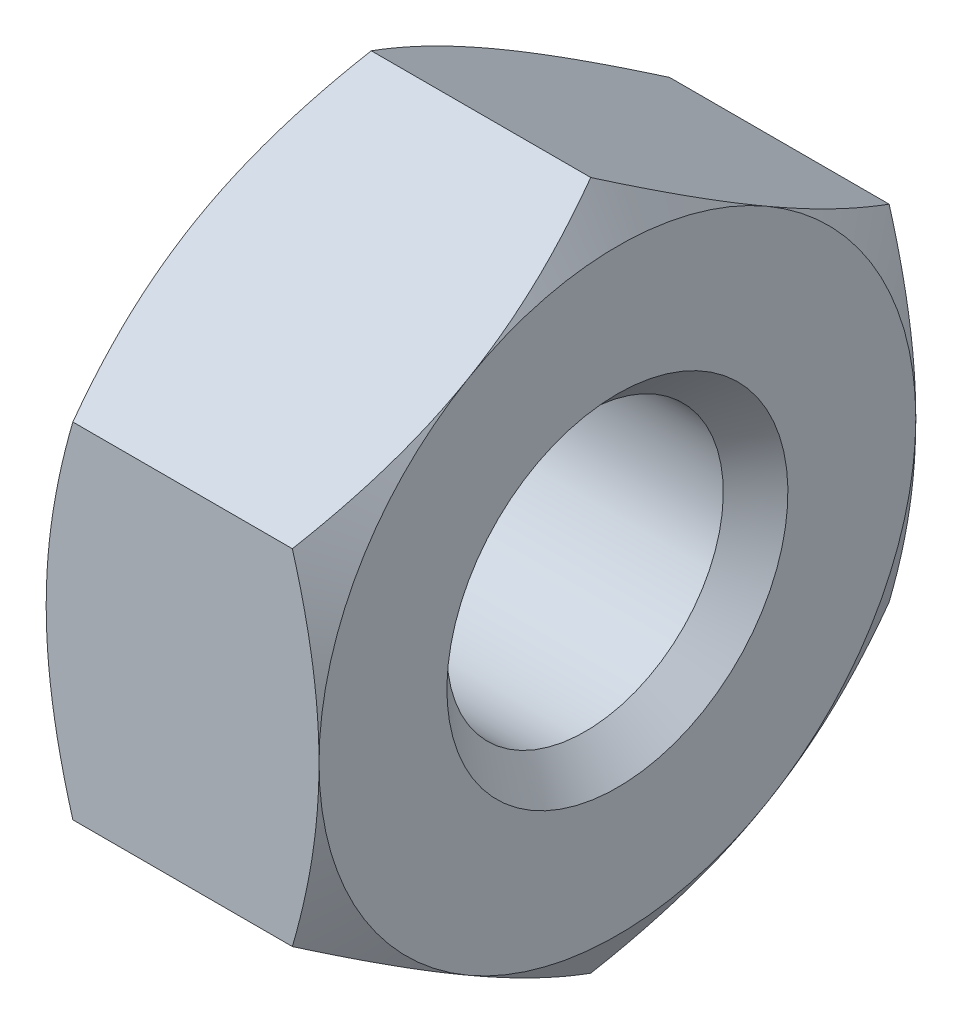
ISO-10303-21;
HEADER;
FILE_DESCRIPTION(('STEP AP214'),'2;1');
FILE_NAME('part.step','',(''),(''),'','','');
FILE_SCHEMA(('AUTOMOTIVE_DESIGN { 1 0 10303 214 1 1 1 1 }'));
ENDSEC;
DATA;
#1=APPLICATION_CONTEXT('core data for automotive mechanical design processes');
#2=APPLICATION_PROTOCOL_DEFINITION('international standard','automotive_design',2000,#1);
#3=PRODUCT_CONTEXT('',#1,'mechanical');
#4=PRODUCT('Part','Part','',(#3));
#5=PRODUCT_RELATED_PRODUCT_CATEGORY('part','',(#4));
#6=PRODUCT_DEFINITION_FORMATION('','',#4);
#7=PRODUCT_DEFINITION_CONTEXT('part definition',#1,'design');
#8=PRODUCT_DEFINITION('design','',#6,#7);
#9=PRODUCT_DEFINITION_SHAPE('','',#8);
#10=(LENGTH_UNIT() NAMED_UNIT(*) SI_UNIT(.MILLI.,.METRE.));
#11=(NAMED_UNIT(*) PLANE_ANGLE_UNIT() SI_UNIT($,.RADIAN.));
#12=(NAMED_UNIT(*) SI_UNIT($,.STERADIAN.) SOLID_ANGLE_UNIT());
#13=UNCERTAINTY_MEASURE_WITH_UNIT(LENGTH_MEASURE(1.E-05),#10,'distance_accuracy_value','');
#14=(GEOMETRIC_REPRESENTATION_CONTEXT(3) GLOBAL_UNCERTAINTY_ASSIGNED_CONTEXT((#13)) GLOBAL_UNIT_ASSIGNED_CONTEXT((#10,
#11,#12)) REPRESENTATION_CONTEXT('',''));
#15=CARTESIAN_POINT('',(0.,0.,0.));
#16=DIRECTION('',(0.,0.,1.));
#17=DIRECTION('',(1.,0.,0.));
#18=AXIS2_PLACEMENT_3D('',#15,#16,#17);
#19=DIRECTION('',(-0.707106781186547,0.707106781186548,0.));
#20=VECTOR('',#19,1.);
#21=CARTESIAN_POINT('',(-498998.,499000.,0.));
#22=LINE('',#21,#20);
#23=CARTESIAN_POINT('',(2.,0.,0.));
#24=DIRECTION('',(-1.,0.,0.));
#25=AXIS1_PLACEMENT('',#23,#24);
#26=SURFACE_OF_REVOLUTION('',#22,#25);
#27=CARTESIAN_POINT('',(0.379,0.,0.));
#28=DIRECTION('',(-1.,0.,0.));
#29=DIRECTION('',(0.,1.,0.));
#30=AXIS2_PLACEMENT_3D('',#27,#28,#29);
#31=CIRCLE('',#30,1.621);
#32=CARTESIAN_POINT('',(0.379,1.621,0.));
#33=VERTEX_POINT('',#32);
#34=EDGE_CURVE('E146',#33,#33,#31,.T.);
#35=ORIENTED_EDGE('',*,*,#34,.F.);
#36=EDGE_LOOP('',(#35));
#37=FACE_BOUND('',#36,.T.);
#38=CARTESIAN_POINT('',(0.,0.,0.));
#39=DIRECTION('',(-1.,0.,0.));
#40=DIRECTION('',(0.,1.,0.));
#41=AXIS2_PLACEMENT_3D('',#38,#39,#40);
#42=CIRCLE('',#41,2.);
#43=CARTESIAN_POINT('',(0.,2.,0.));
#44=VERTEX_POINT('',#43);
#45=EDGE_CURVE('E327',#44,#44,#42,.T.);
#46=ORIENTED_EDGE('',*,*,#45,.T.);
#47=EDGE_LOOP('',(#46));
#48=FACE_BOUND('',#47,.T.);
#49=ADVANCED_FACE('F16',(#37,#48),#26,.F.);
#50=CARTESIAN_POINT('',(0.,2.75,0.));
#51=DIRECTION('',(-1.,0.,0.));
#52=DIRECTION('',(0.,-1.,0.));
#53=AXIS2_PLACEMENT_3D('',#50,#51,#52);
#54=PLANE('',#53);
#55=CARTESIAN_POINT('',(0.,0.,0.));
#56=DIRECTION('',(-1.,0.,0.));
#57=DIRECTION('',(0.,1.,0.));
#58=AXIS2_PLACEMENT_3D('',#55,#56,#57);
#59=CIRCLE('',#58,3.5);
#60=CARTESIAN_POINT('',(0.,3.03108891324554,1.75));
#61=VERTEX_POINT('',#60);
#62=CARTESIAN_POINT('',(0.,3.03108891324554,-1.75));
#63=VERTEX_POINT('',#62);
#64=EDGE_CURVE('E10',#61,#63,#59,.T.);
#65=ORIENTED_EDGE('',*,*,#64,.T.);
#66=CARTESIAN_POINT('',(0.,0.,0.));
#67=DIRECTION('',(-1.,0.,0.));
#68=DIRECTION('',(0.,1.,0.));
#69=AXIS2_PLACEMENT_3D('',#66,#67,#68);
#70=CIRCLE('',#69,3.5);
#71=CARTESIAN_POINT('',(0.,0.,-3.5));
#72=VERTEX_POINT('',#71);
#73=EDGE_CURVE('E26',#63,#72,#70,.T.);
#74=ORIENTED_EDGE('',*,*,#73,.T.);
#75=CARTESIAN_POINT('',(0.,0.,0.));
#76=DIRECTION('',(-1.,0.,0.));
#77=DIRECTION('',(0.,1.,0.));
#78=AXIS2_PLACEMENT_3D('',#75,#76,#77);
#79=CIRCLE('',#78,3.5);
#80=CARTESIAN_POINT('',(0.,-3.03108891324553,-1.75));
#81=VERTEX_POINT('',#80);
#82=EDGE_CURVE('E162',#72,#81,#79,.T.);
#83=ORIENTED_EDGE('',*,*,#82,.T.);
#84=CARTESIAN_POINT('',(0.,0.,0.));
#85=DIRECTION('',(-1.,0.,0.));
#86=DIRECTION('',(0.,1.,0.));
#87=AXIS2_PLACEMENT_3D('',#84,#85,#86);
#88=CIRCLE('',#87,3.5);
#89=CARTESIAN_POINT('',(0.,-3.03108891324554,1.75));
#90=VERTEX_POINT('',#89);
#91=EDGE_CURVE('E168',#81,#90,#88,.T.);
#92=ORIENTED_EDGE('',*,*,#91,.T.);
#93=CARTESIAN_POINT('',(0.,0.,0.));
#94=DIRECTION('',(-1.,0.,0.));
#95=DIRECTION('',(0.,1.,0.));
#96=AXIS2_PLACEMENT_3D('',#93,#94,#95);
#97=CIRCLE('',#96,3.5);
#98=CARTESIAN_POINT('',(0.,0.,3.5));
#99=VERTEX_POINT('',#98);
#100=EDGE_CURVE('E382',#90,#99,#97,.T.);
#101=ORIENTED_EDGE('',*,*,#100,.T.);
#102=CARTESIAN_POINT('',(0.,0.,0.));
#103=DIRECTION('',(-1.,0.,0.));
#104=DIRECTION('',(0.,1.,0.));
#105=AXIS2_PLACEMENT_3D('',#102,#103,#104);
#106=CIRCLE('',#105,3.5);
#107=EDGE_CURVE('E355',#99,#61,#106,.T.);
#108=ORIENTED_EDGE('',*,*,#107,.T.);
#109=EDGE_LOOP('',(#65,#74,#83,#92,#101,#108));
#110=FACE_BOUND('',#109,.T.);
#111=ORIENTED_EDGE('',*,*,#45,.F.);
#112=EDGE_LOOP('',(#111));
#113=FACE_BOUND('',#112,.T.);
#114=ADVANCED_FACE('F192',(#110,#113),#54,.T.);
#115=CARTESIAN_POINT('',(3.2,2.75,0.));
#116=DIRECTION('',(1.,0.,0.));
#117=DIRECTION('',(0.,0.,-1.));
#118=AXIS2_PLACEMENT_3D('',#115,#116,#117);
#119=PLANE('',#118);
#120=CARTESIAN_POINT('',(3.2,0.,0.));
#121=DIRECTION('',(-1.,0.,0.));
#122=DIRECTION('',(0.,1.,0.));
#123=AXIS2_PLACEMENT_3D('',#120,#121,#122);
#124=CIRCLE('',#123,2.);
#125=CARTESIAN_POINT('',(3.2,2.,0.));
#126=VERTEX_POINT('',#125);
#127=EDGE_CURVE('E375',#126,#126,#124,.T.);
#128=ORIENTED_EDGE('',*,*,#127,.T.);
#129=EDGE_LOOP('',(#128));
#130=FACE_BOUND('',#129,.T.);
#131=CARTESIAN_POINT('',(3.2,0.,0.));
#132=DIRECTION('',(-1.,0.,0.));
#133=DIRECTION('',(0.,1.,0.));
#134=AXIS2_PLACEMENT_3D('',#131,#132,#133);
#135=CIRCLE('',#134,3.5);
#136=CARTESIAN_POINT('',(3.2,3.03108891324553,1.75));
#137=VERTEX_POINT('',#136);
#138=CARTESIAN_POINT('',(3.2,3.03108891324554,-1.75));
#139=VERTEX_POINT('',#138);
#140=EDGE_CURVE('E128',#137,#139,#135,.T.);
#141=ORIENTED_EDGE('',*,*,#140,.F.);
#142=CARTESIAN_POINT('',(3.2,0.,0.));
#143=DIRECTION('',(-1.,0.,0.));
#144=DIRECTION('',(0.,1.,0.));
#145=AXIS2_PLACEMENT_3D('',#142,#143,#144);
#146=CIRCLE('',#145,3.5);
#147=CARTESIAN_POINT('',(3.2,0.,3.5));
#148=VERTEX_POINT('',#147);
#149=EDGE_CURVE('E132',#148,#137,#146,.T.);
#150=ORIENTED_EDGE('',*,*,#149,.F.);
#151=CARTESIAN_POINT('',(3.2,0.,0.));
#152=DIRECTION('',(-1.,0.,0.));
#153=DIRECTION('',(0.,1.,0.));
#154=AXIS2_PLACEMENT_3D('',#151,#152,#153);
#155=CIRCLE('',#154,3.5);
#156=CARTESIAN_POINT('',(3.2,-3.03108891324554,1.75));
#157=VERTEX_POINT('',#156);
#158=EDGE_CURVE('E79',#157,#148,#155,.T.);
#159=ORIENTED_EDGE('',*,*,#158,.F.);
#160=CARTESIAN_POINT('',(3.2,0.,0.));
#161=DIRECTION('',(-1.,0.,0.));
#162=DIRECTION('',(0.,1.,0.));
#163=AXIS2_PLACEMENT_3D('',#160,#161,#162);
#164=CIRCLE('',#163,3.5);
#165=CARTESIAN_POINT('',(3.2,-3.03108891324553,-1.75));
#166=VERTEX_POINT('',#165);
#167=EDGE_CURVE('E85',#166,#157,#164,.T.);
#168=ORIENTED_EDGE('',*,*,#167,.F.);
#169=CARTESIAN_POINT('',(3.2,0.,0.));
#170=DIRECTION('',(-1.,0.,0.));
#171=DIRECTION('',(0.,1.,0.));
#172=AXIS2_PLACEMENT_3D('',#169,#170,#171);
#173=CIRCLE('',#172,3.5);
#174=CARTESIAN_POINT('',(3.2,0.,-3.5));
#175=VERTEX_POINT('',#174);
#176=EDGE_CURVE('E151',#175,#166,#173,.T.);
#177=ORIENTED_EDGE('',*,*,#176,.F.);
#178=CARTESIAN_POINT('',(3.2,0.,0.));
#179=DIRECTION('',(-1.,0.,0.));
#180=DIRECTION('',(0.,1.,0.));
#181=AXIS2_PLACEMENT_3D('',#178,#179,#180);
#182=CIRCLE('',#181,3.5);
#183=EDGE_CURVE('E407',#139,#175,#182,.T.);
#184=ORIENTED_EDGE('',*,*,#183,.F.);
#185=EDGE_LOOP('',(#141,#150,#159,#168,#177,#184));
#186=FACE_BOUND('',#185,.T.);
#187=ADVANCED_FACE('F196',(#130,#186),#119,.T.);
#188=DIRECTION('',(0.707106781186548,0.707106781186548,0.));
#189=VECTOR('',#188,1.);
#190=CARTESIAN_POINT('',(499000.,498998.8,0.));
#191=LINE('',#190,#189);
#192=CARTESIAN_POINT('',(1.2,0.,0.));
#193=DIRECTION('',(1.,0.,0.));
#194=AXIS1_PLACEMENT('',#192,#193);
#195=SURFACE_OF_REVOLUTION('',#191,#194);
#196=ORIENTED_EDGE('',*,*,#127,.F.);
#197=EDGE_LOOP('',(#196));
#198=FACE_BOUND('',#197,.T.);
#199=CARTESIAN_POINT('',(2.821,0.,0.));
#200=DIRECTION('',(-1.,0.,0.));
#201=DIRECTION('',(0.,1.,0.));
#202=AXIS2_PLACEMENT_3D('',#199,#200,#201);
#203=CIRCLE('',#202,1.621);
#204=CARTESIAN_POINT('',(2.821,1.621,0.));
#205=VERTEX_POINT('',#204);
#206=EDGE_CURVE('E340',#205,#205,#203,.T.);
#207=ORIENTED_EDGE('',*,*,#206,.T.);
#208=EDGE_LOOP('',(#207));
#209=FACE_BOUND('',#208,.T.);
#210=ADVANCED_FACE('F200',(#198,#209),#195,.F.);
#211=CARTESIAN_POINT('',(1.6,0.,0.));
#212=DIRECTION('',(1.,0.,0.));
#213=DIRECTION('',(0.,1.,0.));
#214=AXIS2_PLACEMENT_3D('',#211,#212,#213);
#215=CIRCLE('',#214,1.621);
#216=DIRECTION('',(-1.,0.,0.));
#217=VECTOR('',#216,1.);
#218=SURFACE_OF_LINEAR_EXTRUSION('',#215,#217);
#219=ORIENTED_EDGE('',*,*,#206,.F.);
#220=EDGE_LOOP('',(#219));
#221=FACE_BOUND('',#220,.T.);
#222=ORIENTED_EDGE('',*,*,#34,.T.);
#223=EDGE_LOOP('',(#222));
#224=FACE_BOUND('',#223,.T.);
#225=ADVANCED_FACE('F204',(#221,#224),#218,.T.);
#226=DIRECTION('',(0.5,-0.866025403784439,0.));
#227=VECTOR('',#226,1.);
#228=CARTESIAN_POINT('',(-288092.563599681,499000.,0.));
#229=LINE('',#228,#227);
#230=CARTESIAN_POINT('',(5.22072594216369,0.,0.));
#231=DIRECTION('',(-1.,0.,0.));
#232=AXIS1_PLACEMENT('',#230,#231);
#233=SURFACE_OF_REVOLUTION('',#229,#232);
#234=CARTESIAN_POINT('',(3.2,3.03108891324553,1.75));
#235=CARTESIAN_POINT('',(3.2,2.5621778264912,2.56217782649084));
#236=CARTESIAN_POINT('',(2.88739260883036,2.02072594216369,3.5));
#237=(BOUNDED_CURVE() B_SPLINE_CURVE(2,(#234,#235,#236),.UNSPECIFIED.,.F.,
.F.) B_SPLINE_CURVE_WITH_KNOTS((3,3),(5.47756078911989,8.00558104426728),
.UNSPECIFIED.) CURVE() GEOMETRIC_REPRESENTATION_ITEM() RATIONAL_B_SPLINE_CURVE((1.,
1.08375764941006,1.09020313656982)) REPRESENTATION_ITEM(''));
#238=CARTESIAN_POINT('',(2.88739260883036,2.02072594216369,3.5));
#239=VERTEX_POINT('',#238);
#240=EDGE_CURVE('E124',#137,#239,#237,.T.);
#241=ORIENTED_EDGE('',*,*,#240,.T.);
#242=CARTESIAN_POINT('',(2.88739260883036,2.02072594216369,3.5));
#243=CARTESIAN_POINT('',(3.2,0.937822173508661,3.5));
#244=CARTESIAN_POINT('',(3.2,0.,3.5));
#245=(BOUNDED_CURVE() B_SPLINE_CURVE(2,(#242,#243,#244),.UNSPECIFIED.,.F.,
.F.) B_SPLINE_CURVE_WITH_KNOTS((3,3),(2.94954053397249,5.47756078911989),
.UNSPECIFIED.) CURVE() GEOMETRIC_REPRESENTATION_ITEM() RATIONAL_B_SPLINE_CURVE((1.09020313656981,
1.08375764941006,1.)) REPRESENTATION_ITEM(''));
#246=EDGE_CURVE('E134',#239,#148,#245,.T.);
#247=ORIENTED_EDGE('',*,*,#246,.T.);
#248=ORIENTED_EDGE('',*,*,#149,.T.);
#249=EDGE_LOOP('',(#241,#247,#248));
#250=FACE_BOUND('',#249,.T.);
#251=ADVANCED_FACE('F208',(#250),#233,.F.);
#252=DIRECTION('',(0.5,-0.866025403784439,0.));
#253=VECTOR('',#252,1.);
#254=CARTESIAN_POINT('',(-288092.563599681,499000.,0.));
#255=LINE('',#254,#253);
#256=CARTESIAN_POINT('',(5.22072594216369,0.,0.));
#257=DIRECTION('',(-1.,0.,0.));
#258=AXIS1_PLACEMENT('',#256,#257);
#259=SURFACE_OF_REVOLUTION('',#255,#258);
#260=CARTESIAN_POINT('',(3.2,3.03108891324554,-1.75));
#261=CARTESIAN_POINT('',(3.2,3.49999999999987,-0.93782217350916));
#262=CARTESIAN_POINT('',(2.88739260883036,4.04145188432738,0.));
#263=(BOUNDED_CURVE() B_SPLINE_CURVE(2,(#260,#261,#262),.UNSPECIFIED.,.F.,
.F.) B_SPLINE_CURVE_WITH_KNOTS((3,3),(5.47756078911989,8.00558104426728),
.UNSPECIFIED.) CURVE() GEOMETRIC_REPRESENTATION_ITEM() RATIONAL_B_SPLINE_CURVE((1.,
1.08375764941006,1.09020313656981)) REPRESENTATION_ITEM(''));
#264=CARTESIAN_POINT('',(2.88739260883036,4.04145188432738,0.));
#265=VERTEX_POINT('',#264);
#266=EDGE_CURVE('E110',#139,#265,#263,.T.);
#267=ORIENTED_EDGE('',*,*,#266,.T.);
#268=CARTESIAN_POINT('',(2.88739260883036,4.04145188432738,0.));
#269=CARTESIAN_POINT('',(3.2,3.49999999999987,0.937822173509159));
#270=CARTESIAN_POINT('',(3.2,3.03108891324553,1.75));
#271=(BOUNDED_CURVE() B_SPLINE_CURVE(2,(#268,#269,#270),.UNSPECIFIED.,.F.,
.F.) B_SPLINE_CURVE_WITH_KNOTS((3,3),(2.94954053397249,5.47756078911989),
.UNSPECIFIED.) CURVE() GEOMETRIC_REPRESENTATION_ITEM() RATIONAL_B_SPLINE_CURVE((1.09020313656982,
1.08375764941006,1.)) REPRESENTATION_ITEM(''));
#272=EDGE_CURVE('E120',#265,#137,#271,.T.);
#273=ORIENTED_EDGE('',*,*,#272,.T.);
#274=ORIENTED_EDGE('',*,*,#140,.T.);
#275=EDGE_LOOP('',(#267,#273,#274));
#276=FACE_BOUND('',#275,.T.);
#277=ADVANCED_FACE('F130',(#276),#259,.F.);
#278=DIRECTION('',(0.5,-0.866025403784439,0.));
#279=VECTOR('',#278,1.);
#280=CARTESIAN_POINT('',(-288092.563599681,499000.,0.));
#281=LINE('',#280,#279);
#282=CARTESIAN_POINT('',(5.22072594216369,0.,0.));
#283=DIRECTION('',(-1.,0.,0.));
#284=AXIS1_PLACEMENT('',#282,#283);
#285=SURFACE_OF_REVOLUTION('',#281,#284);
#286=CARTESIAN_POINT('',(3.2,0.,-3.5));
#287=CARTESIAN_POINT('',(3.2,0.93782217350866,-3.5));
#288=CARTESIAN_POINT('',(2.88739260883036,2.02072594216369,-3.5));
#289=(BOUNDED_CURVE() B_SPLINE_CURVE(2,(#286,#287,#288),.UNSPECIFIED.,.F.,
.F.) B_SPLINE_CURVE_WITH_KNOTS((3,3),(5.47756078911989,8.00558104426728),
.UNSPECIFIED.) CURVE() GEOMETRIC_REPRESENTATION_ITEM() RATIONAL_B_SPLINE_CURVE((1.,
1.08375764941006,1.09020313656981)) REPRESENTATION_ITEM(''));
#290=CARTESIAN_POINT('',(2.88739260883036,2.02072594216369,-3.5));
#291=VERTEX_POINT('',#290);
#292=EDGE_CURVE('E408',#175,#291,#289,.T.);
#293=ORIENTED_EDGE('',*,*,#292,.T.);
#294=CARTESIAN_POINT('',(2.88739260883036,2.02072594216369,-3.5));
#295=CARTESIAN_POINT('',(3.2,2.56217782649121,-2.56217782649084));
#296=CARTESIAN_POINT('',(3.2,3.03108891324554,-1.75));
#297=(BOUNDED_CURVE() B_SPLINE_CURVE(2,(#294,#295,#296),.UNSPECIFIED.,.F.,
.F.) B_SPLINE_CURVE_WITH_KNOTS((3,3),(2.94954053397249,5.47756078911989),
.UNSPECIFIED.) CURVE() GEOMETRIC_REPRESENTATION_ITEM() RATIONAL_B_SPLINE_CURVE((1.09020313656981,
1.08375764941005,1.)) REPRESENTATION_ITEM(''));
#298=EDGE_CURVE('E102',#291,#139,#297,.T.);
#299=ORIENTED_EDGE('',*,*,#298,.T.);
#300=ORIENTED_EDGE('',*,*,#183,.T.);
#301=EDGE_LOOP('',(#293,#299,#300));
#302=FACE_BOUND('',#301,.T.);
#303=ADVANCED_FACE('F221',(#302),#285,.F.);
#304=DIRECTION('',(0.5,-0.866025403784439,0.));
#305=VECTOR('',#304,1.);
#306=CARTESIAN_POINT('',(-288092.563599681,499000.,0.));
#307=LINE('',#306,#305);
#308=CARTESIAN_POINT('',(5.22072594216369,0.,0.));
#309=DIRECTION('',(-1.,0.,0.));
#310=AXIS1_PLACEMENT('',#308,#309);
#311=SURFACE_OF_REVOLUTION('',#307,#310);
#312=CARTESIAN_POINT('',(2.88739260883036,-2.02072594216369,-3.5));
#313=CARTESIAN_POINT('',(3.2,-0.937822173508664,-3.5));
#314=CARTESIAN_POINT('',(3.2,0.,-3.5));
#315=(BOUNDED_CURVE() B_SPLINE_CURVE(2,(#312,#313,#314),.UNSPECIFIED.,.F.,
.F.) B_SPLINE_CURVE_WITH_KNOTS((3,3),(2.94954053397249,5.47756078911989),
.UNSPECIFIED.) CURVE() GEOMETRIC_REPRESENTATION_ITEM() RATIONAL_B_SPLINE_CURVE((1.09020313656982,
1.08375764941006,1.)) REPRESENTATION_ITEM(''));
#316=CARTESIAN_POINT('',(2.88739260883036,-2.02072594216369,-3.5));
#317=VERTEX_POINT('',#316);
#318=EDGE_CURVE('E400',#317,#175,#315,.T.);
#319=ORIENTED_EDGE('',*,*,#318,.T.);
#320=ORIENTED_EDGE('',*,*,#176,.T.);
#321=CARTESIAN_POINT('',(3.2,-3.03108891324553,-1.75));
#322=CARTESIAN_POINT('',(3.2,-2.5621778264912,-2.56217782649084));
#323=CARTESIAN_POINT('',(2.88739260883036,-2.02072594216369,-3.5));
#324=(BOUNDED_CURVE() B_SPLINE_CURVE(2,(#321,#322,#323),.UNSPECIFIED.,.F.,
.F.) B_SPLINE_CURVE_WITH_KNOTS((3,3),(5.47756078911989,8.00558104426728),
.UNSPECIFIED.) CURVE() GEOMETRIC_REPRESENTATION_ITEM() RATIONAL_B_SPLINE_CURVE((1.,
1.08375764941006,1.09020313656981)) REPRESENTATION_ITEM(''));
#325=EDGE_CURVE('E147',#166,#317,#324,.T.);
#326=ORIENTED_EDGE('',*,*,#325,.T.);
#327=EDGE_LOOP('',(#319,#320,#326));
#328=FACE_BOUND('',#327,.T.);
#329=ADVANCED_FACE('F224',(#328),#311,.F.);
#330=DIRECTION('',(0.5,-0.866025403784439,0.));
#331=VECTOR('',#330,1.);
#332=CARTESIAN_POINT('',(-288092.563599681,499000.,0.));
#333=LINE('',#332,#331);
#334=CARTESIAN_POINT('',(5.22072594216369,0.,0.));
#335=DIRECTION('',(-1.,0.,0.));
#336=AXIS1_PLACEMENT('',#334,#335);
#337=SURFACE_OF_REVOLUTION('',#333,#336);
#338=CARTESIAN_POINT('',(2.88739260883036,-4.04145188432738,0.));
#339=CARTESIAN_POINT('',(3.2,-3.49999999999986,-0.937822173509162));
#340=CARTESIAN_POINT('',(3.2,-3.03108891324553,-1.75));
#341=(BOUNDED_CURVE() B_SPLINE_CURVE(2,(#338,#339,#340),.UNSPECIFIED.,.F.,
.F.) B_SPLINE_CURVE_WITH_KNOTS((3,3),(2.9495405339725,5.47756078911989),
.UNSPECIFIED.) CURVE() GEOMETRIC_REPRESENTATION_ITEM() RATIONAL_B_SPLINE_CURVE((1.09020313656981,
1.08375764941005,1.)) REPRESENTATION_ITEM(''));
#342=CARTESIAN_POINT('',(2.88739260883036,-4.04145188432738,0.));
#343=VERTEX_POINT('',#342);
#344=EDGE_CURVE('E152',#343,#166,#341,.T.);
#345=ORIENTED_EDGE('',*,*,#344,.T.);
#346=ORIENTED_EDGE('',*,*,#167,.T.);
#347=CARTESIAN_POINT('',(3.2,-3.03108891324554,1.75));
#348=CARTESIAN_POINT('',(3.2,-3.49999999999987,0.937822173509161));
#349=CARTESIAN_POINT('',(2.88739260883036,-4.04145188432738,0.));
#350=(BOUNDED_CURVE() B_SPLINE_CURVE(2,(#347,#348,#349),.UNSPECIFIED.,.F.,
.F.) B_SPLINE_CURVE_WITH_KNOTS((3,3),(5.47756078911989,8.00558104426728),
.UNSPECIFIED.) CURVE() GEOMETRIC_REPRESENTATION_ITEM() RATIONAL_B_SPLINE_CURVE((1.,
1.08375764941006,1.09020313656981)) REPRESENTATION_ITEM(''));
#351=EDGE_CURVE('E161',#157,#343,#350,.T.);
#352=ORIENTED_EDGE('',*,*,#351,.T.);
#353=EDGE_LOOP('',(#345,#346,#352));
#354=FACE_BOUND('',#353,.T.);
#355=ADVANCED_FACE('F228',(#354),#337,.F.);
#356=DIRECTION('',(0.5,-0.866025403784439,0.));
#357=VECTOR('',#356,1.);
#358=CARTESIAN_POINT('',(-288092.563599681,499000.,0.));
#359=LINE('',#358,#357);
#360=CARTESIAN_POINT('',(5.22072594216369,0.,0.));
#361=DIRECTION('',(-1.,0.,0.));
#362=AXIS1_PLACEMENT('',#360,#361);
#363=SURFACE_OF_REVOLUTION('',#359,#362);
#364=CARTESIAN_POINT('',(2.88739260883036,-2.02072594216369,3.5));
#365=CARTESIAN_POINT('',(3.2,-2.5621778264912,2.56217782649084));
#366=CARTESIAN_POINT('',(3.2,-3.03108891324554,1.75));
#367=(BOUNDED_CURVE() B_SPLINE_CURVE(2,(#364,#365,#366),.UNSPECIFIED.,.F.,
.F.) B_SPLINE_CURVE_WITH_KNOTS((3,3),(2.94954053397249,5.47756078911989),
.UNSPECIFIED.) CURVE() GEOMETRIC_REPRESENTATION_ITEM() RATIONAL_B_SPLINE_CURVE((1.09020313656982,
1.08375764941006,1.)) REPRESENTATION_ITEM(''));
#368=CARTESIAN_POINT('',(2.88739260883036,-2.02072594216369,3.5));
#369=VERTEX_POINT('',#368);
#370=EDGE_CURVE('E153',#369,#157,#367,.T.);
#371=ORIENTED_EDGE('',*,*,#370,.T.);
#372=ORIENTED_EDGE('',*,*,#158,.T.);
#373=CARTESIAN_POINT('',(3.2,0.,3.5));
#374=CARTESIAN_POINT('',(3.2,-0.937822173508663,3.5));
#375=CARTESIAN_POINT('',(2.88739260883036,-2.02072594216369,3.5));
#376=(BOUNDED_CURVE() B_SPLINE_CURVE(2,(#373,#374,#375),.UNSPECIFIED.,.F.,
.F.) B_SPLINE_CURVE_WITH_KNOTS((3,3),(5.47756078911989,8.00558104426728),
.UNSPECIFIED.) CURVE() GEOMETRIC_REPRESENTATION_ITEM() RATIONAL_B_SPLINE_CURVE((1.,
1.08375764941006,1.09020313656981)) REPRESENTATION_ITEM(''));
#377=EDGE_CURVE('E428',#148,#369,#376,.T.);
#378=ORIENTED_EDGE('',*,*,#377,.T.);
#379=EDGE_LOOP('',(#371,#372,#378));
#380=FACE_BOUND('',#379,.T.);
#381=ADVANCED_FACE('F239',(#380),#363,.F.);
#382=DIRECTION('',(-0.5,-0.866025403784439,0.));
#383=VECTOR('',#382,1.);
#384=CARTESIAN_POINT('',(288095.763599681,499000.,0.));
#385=LINE('',#384,#383);
#386=CARTESIAN_POINT('',(-2.02072594216369,0.,0.));
#387=DIRECTION('',(1.,0.,0.));
#388=AXIS1_PLACEMENT('',#386,#387);
#389=SURFACE_OF_REVOLUTION('',#385,#388);
#390=CARTESIAN_POINT('',(0.,3.03108891324554,1.75));
#391=CARTESIAN_POINT('',(0.,3.49999999999987,0.937822173509162));
#392=CARTESIAN_POINT('',(0.312607391169643,4.04145188432738,0.));
#393=(BOUNDED_CURVE() B_SPLINE_CURVE(2,(#390,#391,#392),.UNSPECIFIED.,.F.,
.F.) B_SPLINE_CURVE_WITH_KNOTS((3,3),(5.47756078911989,8.00558104426728),
.UNSPECIFIED.) CURVE() GEOMETRIC_REPRESENTATION_ITEM() RATIONAL_B_SPLINE_CURVE((1.,
1.08375764941006,1.09020313656981)) REPRESENTATION_ITEM(''));
#394=CARTESIAN_POINT('',(0.312607391169643,4.04145188432738,0.));
#395=VERTEX_POINT('',#394);
#396=EDGE_CURVE('E325',#61,#395,#393,.T.);
#397=ORIENTED_EDGE('',*,*,#396,.T.);
#398=CARTESIAN_POINT('',(0.312607391169643,4.04145188432738,0.));
#399=CARTESIAN_POINT('',(0.,3.49999999999987,-0.937822173509162));
#400=CARTESIAN_POINT('',(0.,3.03108891324554,-1.75));
#401=(BOUNDED_CURVE() B_SPLINE_CURVE(2,(#398,#399,#400),.UNSPECIFIED.,.F.,
.F.) B_SPLINE_CURVE_WITH_KNOTS((3,3),(2.9495405339725,5.47756078911989),
.UNSPECIFIED.) CURVE() GEOMETRIC_REPRESENTATION_ITEM() RATIONAL_B_SPLINE_CURVE((1.09020313656981,
1.08375764941005,1.)) REPRESENTATION_ITEM(''));
#402=EDGE_CURVE('E111',#395,#63,#401,.T.);
#403=ORIENTED_EDGE('',*,*,#402,.T.);
#404=ORIENTED_EDGE('',*,*,#64,.F.);
#405=EDGE_LOOP('',(#397,#403,#404));
#406=FACE_BOUND('',#405,.T.);
#407=ADVANCED_FACE('F242',(#406),#389,.F.);
#408=DIRECTION('',(-0.5,-0.866025403784439,0.));
#409=VECTOR('',#408,1.);
#410=CARTESIAN_POINT('',(288095.763599681,499000.,0.));
#411=LINE('',#410,#409);
#412=CARTESIAN_POINT('',(-2.02072594216369,0.,0.));
#413=DIRECTION('',(1.,0.,0.));
#414=AXIS1_PLACEMENT('',#412,#413);
#415=SURFACE_OF_REVOLUTION('',#411,#414);
#416=CARTESIAN_POINT('',(0.,0.,3.5));
#417=CARTESIAN_POINT('',(0.,0.937822173508662,3.5));
#418=CARTESIAN_POINT('',(0.312607391169643,2.02072594216369,3.5));
#419=(BOUNDED_CURVE() B_SPLINE_CURVE(2,(#416,#417,#418),.UNSPECIFIED.,.F.,
.F.) B_SPLINE_CURVE_WITH_KNOTS((3,3),(5.47756078911989,8.00558104426728),
.UNSPECIFIED.) CURVE() GEOMETRIC_REPRESENTATION_ITEM() RATIONAL_B_SPLINE_CURVE((1.,
1.08375764941006,1.09020313656981)) REPRESENTATION_ITEM(''));
#420=CARTESIAN_POINT('',(0.312607391169643,2.02072594216369,3.5));
#421=VERTEX_POINT('',#420);
#422=EDGE_CURVE('E326',#99,#421,#419,.T.);
#423=ORIENTED_EDGE('',*,*,#422,.T.);
#424=CARTESIAN_POINT('',(0.312607391169643,2.02072594216369,3.5));
#425=CARTESIAN_POINT('',(0.,2.5621778264912,2.56217782649084));
#426=CARTESIAN_POINT('',(0.,3.03108891324554,1.75));
#427=(BOUNDED_CURVE() B_SPLINE_CURVE(2,(#424,#425,#426),.UNSPECIFIED.,.F.,
.F.) B_SPLINE_CURVE_WITH_KNOTS((3,3),(2.9495405339725,5.47756078911989),
.UNSPECIFIED.) CURVE() GEOMETRIC_REPRESENTATION_ITEM() RATIONAL_B_SPLINE_CURVE((1.09020313656982,
1.08375764941006,1.)) REPRESENTATION_ITEM(''));
#428=EDGE_CURVE('E350',#421,#61,#427,.T.);
#429=ORIENTED_EDGE('',*,*,#428,.T.);
#430=ORIENTED_EDGE('',*,*,#107,.F.);
#431=EDGE_LOOP('',(#423,#429,#430));
#432=FACE_BOUND('',#431,.T.);
#433=ADVANCED_FACE('F246',(#432),#415,.F.);
#434=DIRECTION('',(-0.5,-0.866025403784439,0.));
#435=VECTOR('',#434,1.);
#436=CARTESIAN_POINT('',(288095.763599681,499000.,0.));
#437=LINE('',#436,#435);
#438=CARTESIAN_POINT('',(-2.02072594216369,0.,0.));
#439=DIRECTION('',(1.,0.,0.));
#440=AXIS1_PLACEMENT('',#438,#439);
#441=SURFACE_OF_REVOLUTION('',#437,#440);
#442=CARTESIAN_POINT('',(0.,-3.03108891324554,1.75));
#443=CARTESIAN_POINT('',(0.,-2.5621778264912,2.56217782649084));
#444=CARTESIAN_POINT('',(0.312607391169643,-2.02072594216369,3.5));
#445=(BOUNDED_CURVE() B_SPLINE_CURVE(2,(#442,#443,#444),.UNSPECIFIED.,.F.,
.F.) B_SPLINE_CURVE_WITH_KNOTS((3,3),(5.47756078911989,8.00558104426728),
.UNSPECIFIED.) CURVE() GEOMETRIC_REPRESENTATION_ITEM() RATIONAL_B_SPLINE_CURVE((1.,
1.08375764941006,1.09020313656982)) REPRESENTATION_ITEM(''));
#446=CARTESIAN_POINT('',(0.312607391169643,-2.02072594216369,3.5));
#447=VERTEX_POINT('',#446);
#448=EDGE_CURVE('E295',#90,#447,#445,.T.);
#449=ORIENTED_EDGE('',*,*,#448,.T.);
#450=CARTESIAN_POINT('',(0.312607391169643,-2.02072594216369,3.5));
#451=CARTESIAN_POINT('',(0.,-0.937822173508658,3.5));
#452=CARTESIAN_POINT('',(0.,0.,3.5));
#453=(BOUNDED_CURVE() B_SPLINE_CURVE(2,(#450,#451,#452),.UNSPECIFIED.,.F.,
.F.) B_SPLINE_CURVE_WITH_KNOTS((3,3),(2.9495405339725,5.47756078911989),
.UNSPECIFIED.) CURVE() GEOMETRIC_REPRESENTATION_ITEM() RATIONAL_B_SPLINE_CURVE((1.09020313656981,
1.08375764941005,1.)) REPRESENTATION_ITEM(''));
#454=EDGE_CURVE('E180',#447,#99,#453,.T.);
#455=ORIENTED_EDGE('',*,*,#454,.T.);
#456=ORIENTED_EDGE('',*,*,#100,.F.);
#457=EDGE_LOOP('',(#449,#455,#456));
#458=FACE_BOUND('',#457,.T.);
#459=ADVANCED_FACE('F250',(#458),#441,.F.);
#460=DIRECTION('',(-0.5,-0.866025403784439,0.));
#461=VECTOR('',#460,1.);
#462=CARTESIAN_POINT('',(288095.763599681,499000.,0.));
#463=LINE('',#462,#461);
#464=CARTESIAN_POINT('',(-2.02072594216369,0.,0.));
#465=DIRECTION('',(1.,0.,0.));
#466=AXIS1_PLACEMENT('',#464,#465);
#467=SURFACE_OF_REVOLUTION('',#463,#466);
#468=CARTESIAN_POINT('',(0.312607391169642,-4.04145188432738,0.));
#469=CARTESIAN_POINT('',(0.,-3.49999999999987,0.937822173509158));
#470=CARTESIAN_POINT('',(0.,-3.03108891324554,1.75));
#471=(BOUNDED_CURVE() B_SPLINE_CURVE(2,(#468,#469,#470),.UNSPECIFIED.,.F.,
.F.) B_SPLINE_CURVE_WITH_KNOTS((3,3),(2.9495405339725,5.47756078911989),
.UNSPECIFIED.) CURVE() GEOMETRIC_REPRESENTATION_ITEM() RATIONAL_B_SPLINE_CURVE((1.09020313656982,
1.08375764941006,1.)) REPRESENTATION_ITEM(''));
#472=CARTESIAN_POINT('',(0.312607391169642,-4.04145188432738,0.));
#473=VERTEX_POINT('',#472);
#474=EDGE_CURVE('E175',#473,#90,#471,.T.);
#475=ORIENTED_EDGE('',*,*,#474,.T.);
#476=ORIENTED_EDGE('',*,*,#91,.F.);
#477=CARTESIAN_POINT('',(0.,-3.03108891324553,-1.75));
#478=CARTESIAN_POINT('',(0.,-3.49999999999987,-0.937822173509159));
#479=CARTESIAN_POINT('',(0.312607391169642,-4.04145188432738,0.));
#480=(BOUNDED_CURVE() B_SPLINE_CURVE(2,(#477,#478,#479),.UNSPECIFIED.,.F.,
.F.) B_SPLINE_CURVE_WITH_KNOTS((3,3),(5.47756078911989,8.00558104426728),
.UNSPECIFIED.) CURVE() GEOMETRIC_REPRESENTATION_ITEM() RATIONAL_B_SPLINE_CURVE((1.,
1.08375764941006,1.09020313656982)) REPRESENTATION_ITEM(''));
#481=EDGE_CURVE('E181',#81,#473,#480,.T.);
#482=ORIENTED_EDGE('',*,*,#481,.T.);
#483=EDGE_LOOP('',(#475,#476,#482));
#484=FACE_BOUND('',#483,.T.);
#485=ADVANCED_FACE('F259',(#484),#467,.F.);
#486=DIRECTION('',(-0.5,-0.866025403784439,0.));
#487=VECTOR('',#486,1.);
#488=CARTESIAN_POINT('',(288095.763599681,499000.,0.));
#489=LINE('',#488,#487);
#490=CARTESIAN_POINT('',(-2.02072594216369,0.,0.));
#491=DIRECTION('',(1.,0.,0.));
#492=AXIS1_PLACEMENT('',#490,#491);
#493=SURFACE_OF_REVOLUTION('',#489,#492);
#494=CARTESIAN_POINT('',(0.312607391169643,-2.02072594216369,-3.5));
#495=CARTESIAN_POINT('',(0.,-2.5621778264912,-2.56217782649084));
#496=CARTESIAN_POINT('',(0.,-3.03108891324553,-1.75));
#497=(BOUNDED_CURVE() B_SPLINE_CURVE(2,(#494,#495,#496),.UNSPECIFIED.,.F.,
.F.) B_SPLINE_CURVE_WITH_KNOTS((3,3),(2.94954053397249,5.47756078911989),
.UNSPECIFIED.) CURVE() GEOMETRIC_REPRESENTATION_ITEM() RATIONAL_B_SPLINE_CURVE((1.09020313656981,
1.08375764941006,1.)) REPRESENTATION_ITEM(''));
#498=CARTESIAN_POINT('',(0.312607391169643,-2.02072594216369,-3.5));
#499=VERTEX_POINT('',#498);
#500=EDGE_CURVE('E302',#499,#81,#497,.T.);
#501=ORIENTED_EDGE('',*,*,#500,.T.);
#502=ORIENTED_EDGE('',*,*,#82,.F.);
#503=CARTESIAN_POINT('',(0.,0.,-3.5));
#504=CARTESIAN_POINT('',(0.,-0.93782217350866,-3.5));
#505=CARTESIAN_POINT('',(0.312607391169643,-2.02072594216369,-3.5));
#506=(BOUNDED_CURVE() B_SPLINE_CURVE(2,(#503,#504,#505),.UNSPECIFIED.,.F.,
.F.) B_SPLINE_CURVE_WITH_KNOTS((3,3),(5.47756078911989,8.00558104426728),
.UNSPECIFIED.) CURVE() GEOMETRIC_REPRESENTATION_ITEM() RATIONAL_B_SPLINE_CURVE((1.,
1.08375764941005,1.09020313656981)) REPRESENTATION_ITEM(''));
#507=EDGE_CURVE('E304',#72,#499,#506,.T.);
#508=ORIENTED_EDGE('',*,*,#507,.T.);
#509=EDGE_LOOP('',(#501,#502,#508));
#510=FACE_BOUND('',#509,.T.);
#511=ADVANCED_FACE('F262',(#510),#493,.F.);
#512=DIRECTION('',(-0.5,-0.866025403784439,0.));
#513=VECTOR('',#512,1.);
#514=CARTESIAN_POINT('',(288095.763599681,499000.,0.));
#515=LINE('',#514,#513);
#516=CARTESIAN_POINT('',(-2.02072594216369,0.,0.));
#517=DIRECTION('',(1.,0.,0.));
#518=AXIS1_PLACEMENT('',#516,#517);
#519=SURFACE_OF_REVOLUTION('',#515,#518);
#520=CARTESIAN_POINT('',(0.312607391169643,2.02072594216369,-3.5));
#521=CARTESIAN_POINT('',(0.,0.937822173508662,-3.5));
#522=CARTESIAN_POINT('',(0.,0.,-3.5));
#523=(BOUNDED_CURVE() B_SPLINE_CURVE(2,(#520,#521,#522),.UNSPECIFIED.,.F.,
.F.) B_SPLINE_CURVE_WITH_KNOTS((3,3),(2.9495405339725,5.47756078911989),
.UNSPECIFIED.) CURVE() GEOMETRIC_REPRESENTATION_ITEM() RATIONAL_B_SPLINE_CURVE((1.09020313656981,
1.08375764941006,1.)) REPRESENTATION_ITEM(''));
#524=CARTESIAN_POINT('',(0.312607391169643,2.02072594216369,-3.5));
#525=VERTEX_POINT('',#524);
#526=EDGE_CURVE('E312',#525,#72,#523,.T.);
#527=ORIENTED_EDGE('',*,*,#526,.T.);
#528=ORIENTED_EDGE('',*,*,#73,.F.);
#529=CARTESIAN_POINT('',(0.,3.03108891324554,-1.75));
#530=CARTESIAN_POINT('',(0.,2.5621778264912,-2.56217782649084));
#531=CARTESIAN_POINT('',(0.312607391169643,2.02072594216369,-3.5));
#532=(BOUNDED_CURVE() B_SPLINE_CURVE(2,(#529,#530,#531),.UNSPECIFIED.,.F.,
.F.) B_SPLINE_CURVE_WITH_KNOTS((3,3),(5.47756078911989,8.00558104426728),
.UNSPECIFIED.) CURVE() GEOMETRIC_REPRESENTATION_ITEM() RATIONAL_B_SPLINE_CURVE((1.,
1.08375764941006,1.09020313656982)) REPRESENTATION_ITEM(''));
#533=EDGE_CURVE('E35',#63,#525,#532,.T.);
#534=ORIENTED_EDGE('',*,*,#533,.T.);
#535=EDGE_LOOP('',(#527,#528,#534));
#536=FACE_BOUND('',#535,.T.);
#537=ADVANCED_FACE('F266',(#536),#519,.F.);
#538=CARTESIAN_POINT('',(4.2,-2.02072594216369,-3.5));
#539=DIRECTION('',(0.,-0.866025403784439,-0.5));
#540=DIRECTION('',(0.,0.5,-0.866025403784439));
#541=AXIS2_PLACEMENT_3D('',#538,#539,#540);
#542=PLANE('',#541);
#543=ORIENTED_EDGE('',*,*,#481,.F.);
#544=ORIENTED_EDGE('',*,*,#500,.F.);
#545=DIRECTION('',(-1.,0.,0.));
#546=VECTOR('',#545,1.);
#547=CARTESIAN_POINT('',(4.2,-2.02072594216369,-3.5));
#548=LINE('',#547,#546);
#549=EDGE_CURVE('E169',#317,#499,#548,.T.);
#550=ORIENTED_EDGE('',*,*,#549,.F.);
#551=ORIENTED_EDGE('',*,*,#325,.F.);
#552=ORIENTED_EDGE('',*,*,#344,.F.);
#553=DIRECTION('',(-1.,0.,0.));
#554=VECTOR('',#553,1.);
#555=CARTESIAN_POINT('',(4.2,-4.04145188432738,0.));
#556=LINE('',#555,#554);
#557=EDGE_CURVE('E172',#343,#473,#556,.T.);
#558=ORIENTED_EDGE('',*,*,#557,.T.);
#559=EDGE_LOOP('',(#543,#544,#550,#551,#552,#558));
#560=FACE_BOUND('',#559,.T.);
#561=ADVANCED_FACE('F270',(#560),#542,.T.);
#562=CARTESIAN_POINT('',(4.2,2.02072594216369,-3.5));
#563=DIRECTION('',(0.,0.,-1.));
#564=DIRECTION('',(-1.,0.,0.));
#565=AXIS2_PLACEMENT_3D('',#562,#563,#564);
#566=PLANE('',#565);
#567=ORIENTED_EDGE('',*,*,#507,.F.);
#568=ORIENTED_EDGE('',*,*,#526,.F.);
#569=DIRECTION('',(-1.,0.,0.));
#570=VECTOR('',#569,1.);
#571=CARTESIAN_POINT('',(4.2,2.02072594216369,-3.5));
#572=LINE('',#571,#570);
#573=EDGE_CURVE('E173',#291,#525,#572,.T.);
#574=ORIENTED_EDGE('',*,*,#573,.F.);
#575=ORIENTED_EDGE('',*,*,#292,.F.);
#576=ORIENTED_EDGE('',*,*,#318,.F.);
#577=ORIENTED_EDGE('',*,*,#549,.T.);
#578=EDGE_LOOP('',(#567,#568,#574,#575,#576,#577));
#579=FACE_BOUND('',#578,.T.);
#580=ADVANCED_FACE('F274',(#579),#566,.T.);
#581=CARTESIAN_POINT('',(4.2,4.04145188432738,0.));
#582=DIRECTION('',(0.,0.866025403784439,-0.5));
#583=DIRECTION('',(0.,0.5,0.866025403784439));
#584=AXIS2_PLACEMENT_3D('',#581,#582,#583);
#585=PLANE('',#584);
#586=ORIENTED_EDGE('',*,*,#533,.F.);
#587=ORIENTED_EDGE('',*,*,#402,.F.);
#588=DIRECTION('',(-1.,0.,0.));
#589=VECTOR('',#588,1.);
#590=CARTESIAN_POINT('',(4.2,4.04145188432738,0.));
#591=LINE('',#590,#589);
#592=EDGE_CURVE('E106',#265,#395,#591,.T.);
#593=ORIENTED_EDGE('',*,*,#592,.F.);
#594=ORIENTED_EDGE('',*,*,#266,.F.);
#595=ORIENTED_EDGE('',*,*,#298,.F.);
#596=ORIENTED_EDGE('',*,*,#573,.T.);
#597=EDGE_LOOP('',(#586,#587,#593,#594,#595,#596));
#598=FACE_BOUND('',#597,.T.);
#599=ADVANCED_FACE('F108',(#598),#585,.T.);
#600=CARTESIAN_POINT('',(4.2,-2.02072594216369,3.5));
#601=DIRECTION('',(0.,0.,1.));
#602=DIRECTION('',(1.,0.,0.));
#603=AXIS2_PLACEMENT_3D('',#600,#601,#602);
#604=PLANE('',#603);
#605=ORIENTED_EDGE('',*,*,#454,.F.);
#606=DIRECTION('',(-1.,0.,0.));
#607=VECTOR('',#606,1.);
#608=CARTESIAN_POINT('',(4.2,-2.02072594216369,3.5));
#609=LINE('',#608,#607);
#610=EDGE_CURVE('E116',#369,#447,#609,.T.);
#611=ORIENTED_EDGE('',*,*,#610,.F.);
#612=ORIENTED_EDGE('',*,*,#377,.F.);
#613=ORIENTED_EDGE('',*,*,#246,.F.);
#614=DIRECTION('',(-1.,0.,0.));
#615=VECTOR('',#614,1.);
#616=CARTESIAN_POINT('',(4.2,2.02072594216369,3.5));
#617=LINE('',#616,#615);
#618=EDGE_CURVE('E115',#239,#421,#617,.T.);
#619=ORIENTED_EDGE('',*,*,#618,.T.);
#620=ORIENTED_EDGE('',*,*,#422,.F.);
#621=EDGE_LOOP('',(#605,#611,#612,#613,#619,#620));
#622=FACE_BOUND('',#621,.T.);
#623=ADVANCED_FACE('F281',(#622),#604,.T.);
#624=CARTESIAN_POINT('',(4.2,2.02072594216369,3.5));
#625=DIRECTION('',(0.,0.866025403784439,0.5));
#626=DIRECTION('',(0.,-0.5,0.866025403784439));
#627=AXIS2_PLACEMENT_3D('',#624,#625,#626);
#628=PLANE('',#627);
#629=ORIENTED_EDGE('',*,*,#428,.F.);
#630=ORIENTED_EDGE('',*,*,#618,.F.);
#631=ORIENTED_EDGE('',*,*,#240,.F.);
#632=ORIENTED_EDGE('',*,*,#272,.F.);
#633=ORIENTED_EDGE('',*,*,#592,.T.);
#634=ORIENTED_EDGE('',*,*,#396,.F.);
#635=EDGE_LOOP('',(#629,#630,#631,#632,#633,#634));
#636=FACE_BOUND('',#635,.T.);
#637=ADVANCED_FACE('F121',(#636),#628,.T.);
#638=CARTESIAN_POINT('',(4.2,-4.04145188432738,0.));
#639=DIRECTION('',(0.,-0.866025403784439,0.5));
#640=DIRECTION('',(0.,-0.5,-0.866025403784439));
#641=AXIS2_PLACEMENT_3D('',#638,#639,#640);
#642=PLANE('',#641);
#643=ORIENTED_EDGE('',*,*,#474,.F.);
#644=ORIENTED_EDGE('',*,*,#557,.F.);
#645=ORIENTED_EDGE('',*,*,#351,.F.);
#646=ORIENTED_EDGE('',*,*,#370,.F.);
#647=ORIENTED_EDGE('',*,*,#610,.T.);
#648=ORIENTED_EDGE('',*,*,#448,.F.);
#649=EDGE_LOOP('',(#643,#644,#645,#646,#647,#648));
#650=FACE_BOUND('',#649,.T.);
#651=ADVANCED_FACE('F18',(#650),#642,.T.);
#652=CLOSED_SHELL('',(#49,#114,#187,#210,#225,#251,#277,#303,#329,#355,#381,#407,#433,#459,#485,
#511,#537,#561,#580,#599,#623,#637,#651));
#653=MANIFOLD_SOLID_BREP('B1',#652);
#654=ADVANCED_BREP_SHAPE_REPRESENTATION('',(#18,#653),#14);
#655=SHAPE_DEFINITION_REPRESENTATION(#9,#654);
ENDSEC;
END-ISO-10303-21;
